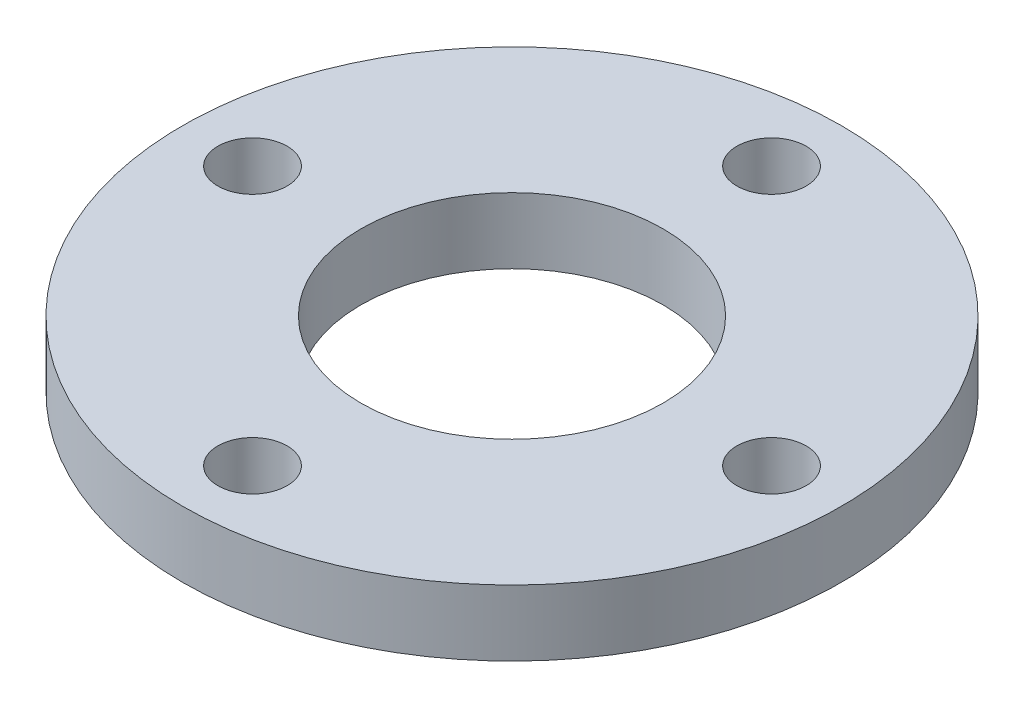
ISO-10303-21;
HEADER;
FILE_DESCRIPTION(('STEP AP214'),'2;1');
FILE_NAME('part.step','',(''),(''),'','','');
FILE_SCHEMA(('AUTOMOTIVE_DESIGN { 1 0 10303 214 1 1 1 1 }'));
ENDSEC;
DATA;
#1=APPLICATION_CONTEXT('core data for automotive mechanical design processes');
#2=APPLICATION_PROTOCOL_DEFINITION('international standard','automotive_design',2000,#1);
#3=PRODUCT_CONTEXT('',#1,'mechanical');
#4=PRODUCT('Part','Part','',(#3));
#5=PRODUCT_RELATED_PRODUCT_CATEGORY('part','',(#4));
#6=PRODUCT_DEFINITION_FORMATION('','',#4);
#7=PRODUCT_DEFINITION_CONTEXT('part definition',#1,'design');
#8=PRODUCT_DEFINITION('design','',#6,#7);
#9=PRODUCT_DEFINITION_SHAPE('','',#8);
#10=(LENGTH_UNIT() NAMED_UNIT(*) SI_UNIT(.MILLI.,.METRE.));
#11=(NAMED_UNIT(*) PLANE_ANGLE_UNIT() SI_UNIT($,.RADIAN.));
#12=(NAMED_UNIT(*) SI_UNIT($,.STERADIAN.) SOLID_ANGLE_UNIT());
#13=UNCERTAINTY_MEASURE_WITH_UNIT(LENGTH_MEASURE(1.E-05),#10,'distance_accuracy_value','');
#14=(GEOMETRIC_REPRESENTATION_CONTEXT(3) GLOBAL_UNCERTAINTY_ASSIGNED_CONTEXT((#13)) GLOBAL_UNIT_ASSIGNED_CONTEXT((#10,
#11,#12)) REPRESENTATION_CONTEXT('',''));
#15=CARTESIAN_POINT('',(0.,0.,0.));
#16=DIRECTION('',(0.,0.,1.));
#17=DIRECTION('',(1.,0.,0.));
#18=AXIS2_PLACEMENT_3D('',#15,#16,#17);
#19=CARTESIAN_POINT('',(0.,3.81,0.));
#20=DIRECTION('',(0.,1.,0.));
#21=DIRECTION('',(0.,0.,1.));
#22=AXIS2_PLACEMENT_3D('',#19,#20,#21);
#23=PLANE('',#22);
#24=CARTESIAN_POINT('',(-15.00124,3.81,0.));
#25=DIRECTION('',(0.,1.,0.));
#26=DIRECTION('',(0.,0.,1.));
#27=AXIS2_PLACEMENT_3D('',#24,#25,#26);
#28=CIRCLE('',#27,2.);
#29=CARTESIAN_POINT('',(-15.00124,3.81,-2.));
#30=VERTEX_POINT('',#29);
#31=EDGE_CURVE('E76',#30,#30,#28,.T.);
#32=ORIENTED_EDGE('',*,*,#31,.F.);
#33=EDGE_LOOP('',(#32));
#34=FACE_BOUND('',#33,.T.);
#35=CARTESIAN_POINT('',(15.00124,3.81,0.));
#36=DIRECTION('',(0.,1.,0.));
#37=DIRECTION('',(0.,0.,1.));
#38=AXIS2_PLACEMENT_3D('',#35,#36,#37);
#39=CIRCLE('',#38,2.);
#40=CARTESIAN_POINT('',(15.00124,3.81,-2.));
#41=VERTEX_POINT('',#40);
#42=EDGE_CURVE('E60',#41,#41,#39,.T.);
#43=ORIENTED_EDGE('',*,*,#42,.F.);
#44=EDGE_LOOP('',(#43));
#45=FACE_BOUND('',#44,.T.);
#46=CARTESIAN_POINT('',(0.,3.81,0.));
#47=DIRECTION('',(0.,1.,0.));
#48=DIRECTION('',(0.,0.,1.));
#49=AXIS2_PLACEMENT_3D('',#46,#47,#48);
#50=CIRCLE('',#49,19.05);
#51=CARTESIAN_POINT('',(0.,3.81,-19.05));
#52=VERTEX_POINT('',#51);
#53=EDGE_CURVE('E10',#52,#52,#50,.T.);
#54=ORIENTED_EDGE('',*,*,#53,.T.);
#55=EDGE_LOOP('',(#54));
#56=FACE_BOUND('',#55,.T.);
#57=CARTESIAN_POINT('',(0.,3.81,0.));
#58=DIRECTION('',(0.,1.,0.));
#59=DIRECTION('',(0.,0.,1.));
#60=AXIS2_PLACEMENT_3D('',#57,#58,#59);
#61=CIRCLE('',#60,8.73125);
#62=CARTESIAN_POINT('',(0.,3.81,-8.73125));
#63=VERTEX_POINT('',#62);
#64=EDGE_CURVE('E54',#63,#63,#61,.T.);
#65=ORIENTED_EDGE('',*,*,#64,.F.);
#66=EDGE_LOOP('',(#65));
#67=FACE_BOUND('',#66,.T.);
#68=CARTESIAN_POINT('',(0.,3.81,-15.00124));
#69=DIRECTION('',(0.,1.,0.));
#70=DIRECTION('',(0.,0.,1.));
#71=AXIS2_PLACEMENT_3D('',#68,#69,#70);
#72=CIRCLE('',#71,2.);
#73=CARTESIAN_POINT('',(0.,3.81,-17.00124));
#74=VERTEX_POINT('',#73);
#75=EDGE_CURVE('E68',#74,#74,#72,.T.);
#76=ORIENTED_EDGE('',*,*,#75,.F.);
#77=EDGE_LOOP('',(#76));
#78=FACE_BOUND('',#77,.T.);
#79=CARTESIAN_POINT('',(0.,3.81,15.00124));
#80=DIRECTION('',(0.,1.,0.));
#81=DIRECTION('',(0.,0.,1.));
#82=AXIS2_PLACEMENT_3D('',#79,#80,#81);
#83=CIRCLE('',#82,2.);
#84=CARTESIAN_POINT('',(0.,3.81,13.00124));
#85=VERTEX_POINT('',#84);
#86=EDGE_CURVE('E84',#85,#85,#83,.T.);
#87=ORIENTED_EDGE('',*,*,#86,.F.);
#88=EDGE_LOOP('',(#87));
#89=FACE_BOUND('',#88,.T.);
#90=ADVANCED_FACE('F41',(#34,#45,#56,#67,#78,#89),#23,.T.);
#91=CARTESIAN_POINT('',(0.,0.,0.));
#92=DIRECTION('',(0.,1.,0.));
#93=DIRECTION('',(0.,0.,1.));
#94=AXIS2_PLACEMENT_3D('',#91,#92,#93);
#95=PLANE('',#94);
#96=CARTESIAN_POINT('',(0.,0.,0.));
#97=DIRECTION('',(0.,1.,0.));
#98=DIRECTION('',(0.,0.,1.));
#99=AXIS2_PLACEMENT_3D('',#96,#97,#98);
#100=CIRCLE('',#99,19.05);
#101=CARTESIAN_POINT('',(0.,0.,-19.05));
#102=VERTEX_POINT('',#101);
#103=EDGE_CURVE('E45',#102,#102,#100,.T.);
#104=ORIENTED_EDGE('',*,*,#103,.F.);
#105=EDGE_LOOP('',(#104));
#106=FACE_BOUND('',#105,.T.);
#107=CARTESIAN_POINT('',(0.,0.,0.));
#108=DIRECTION('',(0.,1.,0.));
#109=DIRECTION('',(0.,0.,1.));
#110=AXIS2_PLACEMENT_3D('',#107,#108,#109);
#111=CIRCLE('',#110,8.73125);
#112=CARTESIAN_POINT('',(0.,0.,-8.73125));
#113=VERTEX_POINT('',#112);
#114=EDGE_CURVE('E56',#113,#113,#111,.T.);
#115=ORIENTED_EDGE('',*,*,#114,.T.);
#116=EDGE_LOOP('',(#115));
#117=FACE_BOUND('',#116,.T.);
#118=CARTESIAN_POINT('',(15.00124,0.,0.));
#119=DIRECTION('',(0.,1.,0.));
#120=DIRECTION('',(0.,0.,1.));
#121=AXIS2_PLACEMENT_3D('',#118,#119,#120);
#122=CIRCLE('',#121,2.);
#123=CARTESIAN_POINT('',(15.00124,0.,-2.));
#124=VERTEX_POINT('',#123);
#125=EDGE_CURVE('E64',#124,#124,#122,.T.);
#126=ORIENTED_EDGE('',*,*,#125,.T.);
#127=EDGE_LOOP('',(#126));
#128=FACE_BOUND('',#127,.T.);
#129=CARTESIAN_POINT('',(0.,0.,-15.00124));
#130=DIRECTION('',(0.,1.,0.));
#131=DIRECTION('',(0.,0.,1.));
#132=AXIS2_PLACEMENT_3D('',#129,#130,#131);
#133=CIRCLE('',#132,2.);
#134=CARTESIAN_POINT('',(0.,0.,-17.00124));
#135=VERTEX_POINT('',#134);
#136=EDGE_CURVE('E72',#135,#135,#133,.T.);
#137=ORIENTED_EDGE('',*,*,#136,.T.);
#138=EDGE_LOOP('',(#137));
#139=FACE_BOUND('',#138,.T.);
#140=CARTESIAN_POINT('',(-15.00124,0.,0.));
#141=DIRECTION('',(0.,1.,0.));
#142=DIRECTION('',(0.,0.,1.));
#143=AXIS2_PLACEMENT_3D('',#140,#141,#142);
#144=CIRCLE('',#143,2.);
#145=CARTESIAN_POINT('',(-15.00124,0.,-2.));
#146=VERTEX_POINT('',#145);
#147=EDGE_CURVE('E80',#146,#146,#144,.T.);
#148=ORIENTED_EDGE('',*,*,#147,.T.);
#149=EDGE_LOOP('',(#148));
#150=FACE_BOUND('',#149,.T.);
#151=CARTESIAN_POINT('',(0.,0.,15.00124));
#152=DIRECTION('',(0.,1.,0.));
#153=DIRECTION('',(0.,0.,1.));
#154=AXIS2_PLACEMENT_3D('',#151,#152,#153);
#155=CIRCLE('',#154,2.);
#156=CARTESIAN_POINT('',(0.,0.,13.00124));
#157=VERTEX_POINT('',#156);
#158=EDGE_CURVE('E88',#157,#157,#155,.T.);
#159=ORIENTED_EDGE('',*,*,#158,.T.);
#160=EDGE_LOOP('',(#159));
#161=FACE_BOUND('',#160,.T.);
#162=ADVANCED_FACE('F100',(#106,#117,#128,#139,#150,#161),#95,.F.);
#163=CARTESIAN_POINT('',(0.,3.81,0.));
#164=DIRECTION('',(0.,-1.,0.));
#165=DIRECTION('',(0.,0.,-1.));
#166=AXIS2_PLACEMENT_3D('',#163,#164,#165);
#167=CYLINDRICAL_SURFACE('',#166,19.05);
#168=CARTESIAN_POINT('',(0.,3.81,-19.05));
#169=CARTESIAN_POINT('',(0.,3.7703125,-19.05));
#170=CARTESIAN_POINT('',(0.,3.730625,-19.05));
#171=CARTESIAN_POINT('',(0.,3.65125,-19.05));
#172=CARTESIAN_POINT('',(0.,3.6115625,-19.05));
#173=CARTESIAN_POINT('',(0.,3.5321875,-19.05));
#174=CARTESIAN_POINT('',(0.,3.4925,-19.05));
#175=CARTESIAN_POINT('',(0.,3.413125,-19.05));
#176=CARTESIAN_POINT('',(0.,3.3734375,-19.05));
#177=CARTESIAN_POINT('',(0.,3.2940625,-19.05));
#178=CARTESIAN_POINT('',(0.,3.254375,-19.05));
#179=CARTESIAN_POINT('',(0.,3.175,-19.05));
#180=CARTESIAN_POINT('',(0.,3.1353125,-19.05));
#181=CARTESIAN_POINT('',(0.,3.0559375,-19.05));
#182=CARTESIAN_POINT('',(0.,3.01625,-19.05));
#183=CARTESIAN_POINT('',(0.,2.936875,-19.05));
#184=CARTESIAN_POINT('',(0.,2.8971875,-19.05));
#185=CARTESIAN_POINT('',(0.,2.8178125,-19.05));
#186=CARTESIAN_POINT('',(0.,2.778125,-19.05));
#187=CARTESIAN_POINT('',(0.,2.69875,-19.05));
#188=CARTESIAN_POINT('',(0.,2.6590625,-19.05));
#189=CARTESIAN_POINT('',(0.,2.5796875,-19.05));
#190=CARTESIAN_POINT('',(0.,2.54,-19.05));
#191=CARTESIAN_POINT('',(0.,2.460625,-19.05));
#192=CARTESIAN_POINT('',(0.,2.4209375,-19.05));
#193=CARTESIAN_POINT('',(0.,2.3415625,-19.05));
#194=CARTESIAN_POINT('',(0.,2.301875,-19.05));
#195=CARTESIAN_POINT('',(0.,2.2225,-19.05));
#196=CARTESIAN_POINT('',(0.,2.1828125,-19.05));
#197=CARTESIAN_POINT('',(0.,2.1034375,-19.05));
#198=CARTESIAN_POINT('',(0.,2.06375,-19.05));
#199=CARTESIAN_POINT('',(0.,1.984375,-19.05));
#200=CARTESIAN_POINT('',(0.,1.9446875,-19.05));
#201=CARTESIAN_POINT('',(0.,1.8653125,-19.05));
#202=CARTESIAN_POINT('',(0.,1.825625,-19.05));
#203=CARTESIAN_POINT('',(0.,1.74625,-19.05));
#204=CARTESIAN_POINT('',(0.,1.7065625,-19.05));
#205=CARTESIAN_POINT('',(0.,1.6271875,-19.05));
#206=CARTESIAN_POINT('',(0.,1.5875,-19.05));
#207=CARTESIAN_POINT('',(0.,1.508125,-19.05));
#208=CARTESIAN_POINT('',(0.,1.4684375,-19.05));
#209=CARTESIAN_POINT('',(0.,1.3890625,-19.05));
#210=CARTESIAN_POINT('',(0.,1.349375,-19.05));
#211=CARTESIAN_POINT('',(0.,1.27,-19.05));
#212=CARTESIAN_POINT('',(0.,1.2303125,-19.05));
#213=CARTESIAN_POINT('',(0.,1.1509375,-19.05));
#214=CARTESIAN_POINT('',(0.,1.11125,-19.05));
#215=CARTESIAN_POINT('',(0.,1.031875,-19.05));
#216=CARTESIAN_POINT('',(0.,0.9921875,-19.05));
#217=CARTESIAN_POINT('',(0.,0.9128125,-19.05));
#218=CARTESIAN_POINT('',(0.,0.873125,-19.05));
#219=CARTESIAN_POINT('',(0.,0.79375,-19.05));
#220=CARTESIAN_POINT('',(0.,0.7540625,-19.05));
#221=CARTESIAN_POINT('',(0.,0.6746875,-19.05));
#222=CARTESIAN_POINT('',(0.,0.635,-19.05));
#223=CARTESIAN_POINT('',(0.,0.555625,-19.05));
#224=CARTESIAN_POINT('',(0.,0.5159375,-19.05));
#225=CARTESIAN_POINT('',(0.,0.4365625,-19.05));
#226=CARTESIAN_POINT('',(0.,0.396875,-19.05));
#227=CARTESIAN_POINT('',(0.,0.3175,-19.05));
#228=CARTESIAN_POINT('',(0.,0.2778125,-19.05));
#229=CARTESIAN_POINT('',(0.,0.1984375,-19.05));
#230=CARTESIAN_POINT('',(0.,0.15875,-19.05));
#231=CARTESIAN_POINT('',(0.,0.0793749999999999,-19.05));
#232=CARTESIAN_POINT('',(0.,0.0396874999999999,-19.05));
#233=CARTESIAN_POINT('',(0.,0.,-19.05));
#234=B_SPLINE_CURVE_WITH_KNOTS('',3,(#168,#169,#170,#171,#172,#173,#174,#175,#176,#177,#178,
#179,#180,#181,#182,#183,#184,#185,#186,#187,#188,#189,#190,#191,#192,#193,#194,#195,#196,#197,
#198,#199,#200,#201,#202,#203,#204,#205,#206,#207,#208,#209,#210,#211,#212,#213,#214,#215,#216,
#217,#218,#219,#220,#221,#222,#223,#224,#225,#226,#227,#228,#229,#230,#231,#232,#233),
.UNSPECIFIED.,.F.,.F.,(4,2,2,2,2,2,2,2,2,2,2,2,2,2,2,2,2,2,2,2,2,2,2,2,2,2,2,2,2,2,2,2,4),(0.,
0.1190625,0.238125,0.3571875,0.47625,0.5953125,0.714375,0.8334375,0.9525,1.0715625,1.190625,
1.3096875,1.42875,1.5478125,1.666875,1.7859375,1.905,2.0240625,2.143125,2.2621875,2.38125,
2.5003125,2.619375,2.7384375,2.8575,2.9765625,3.095625,3.2146875,3.33375,3.4528125,3.571875,
3.6909375,3.81),.UNSPECIFIED.);
#235=EDGE_CURVE('BSEAM43',#52,#102,#234,.T.);
#236=ORIENTED_EDGE('',*,*,#53,.F.);
#237=ORIENTED_EDGE('',*,*,#103,.T.);
#238=ORIENTED_EDGE('',*,*,#235,.T.);
#239=ORIENTED_EDGE('',*,*,#235,.F.);
#240=EDGE_LOOP('',(#236,#238,#237,#239));
#241=FACE_BOUND('',#240,.T.);
#242=ADVANCED_FACE('F43',(#241),#167,.T.);
#243=CARTESIAN_POINT('',(0.,3.81,0.));
#244=DIRECTION('',(0.,-1.,0.));
#245=DIRECTION('',(0.,0.,-1.));
#246=AXIS2_PLACEMENT_3D('',#243,#244,#245);
#247=CYLINDRICAL_SURFACE('',#246,8.73125);
#248=CARTESIAN_POINT('',(0.,3.81,-8.73125));
#249=CARTESIAN_POINT('',(0.,3.7703125,-8.73125));
#250=CARTESIAN_POINT('',(0.,3.730625,-8.73125));
#251=CARTESIAN_POINT('',(0.,3.65125,-8.73125));
#252=CARTESIAN_POINT('',(0.,3.6115625,-8.73125));
#253=CARTESIAN_POINT('',(0.,3.5321875,-8.73125));
#254=CARTESIAN_POINT('',(0.,3.4925,-8.73125));
#255=CARTESIAN_POINT('',(0.,3.413125,-8.73125));
#256=CARTESIAN_POINT('',(0.,3.3734375,-8.73125));
#257=CARTESIAN_POINT('',(0.,3.2940625,-8.73125));
#258=CARTESIAN_POINT('',(0.,3.254375,-8.73125));
#259=CARTESIAN_POINT('',(0.,3.175,-8.73125));
#260=CARTESIAN_POINT('',(0.,3.1353125,-8.73125));
#261=CARTESIAN_POINT('',(0.,3.0559375,-8.73125));
#262=CARTESIAN_POINT('',(0.,3.01625,-8.73125));
#263=CARTESIAN_POINT('',(0.,2.936875,-8.73125));
#264=CARTESIAN_POINT('',(0.,2.8971875,-8.73125));
#265=CARTESIAN_POINT('',(0.,2.8178125,-8.73125));
#266=CARTESIAN_POINT('',(0.,2.778125,-8.73125));
#267=CARTESIAN_POINT('',(0.,2.69875,-8.73125));
#268=CARTESIAN_POINT('',(0.,2.6590625,-8.73125));
#269=CARTESIAN_POINT('',(0.,2.5796875,-8.73125));
#270=CARTESIAN_POINT('',(0.,2.54,-8.73125));
#271=CARTESIAN_POINT('',(0.,2.460625,-8.73125));
#272=CARTESIAN_POINT('',(0.,2.4209375,-8.73125));
#273=CARTESIAN_POINT('',(0.,2.3415625,-8.73125));
#274=CARTESIAN_POINT('',(0.,2.301875,-8.73125));
#275=CARTESIAN_POINT('',(0.,2.2225,-8.73125));
#276=CARTESIAN_POINT('',(0.,2.1828125,-8.73125));
#277=CARTESIAN_POINT('',(0.,2.1034375,-8.73125));
#278=CARTESIAN_POINT('',(0.,2.06375,-8.73125));
#279=CARTESIAN_POINT('',(0.,1.984375,-8.73125));
#280=CARTESIAN_POINT('',(0.,1.9446875,-8.73125));
#281=CARTESIAN_POINT('',(0.,1.8653125,-8.73125));
#282=CARTESIAN_POINT('',(0.,1.825625,-8.73125));
#283=CARTESIAN_POINT('',(0.,1.74625,-8.73125));
#284=CARTESIAN_POINT('',(0.,1.7065625,-8.73125));
#285=CARTESIAN_POINT('',(0.,1.6271875,-8.73125));
#286=CARTESIAN_POINT('',(0.,1.5875,-8.73125));
#287=CARTESIAN_POINT('',(0.,1.508125,-8.73125));
#288=CARTESIAN_POINT('',(0.,1.4684375,-8.73125));
#289=CARTESIAN_POINT('',(0.,1.3890625,-8.73125));
#290=CARTESIAN_POINT('',(0.,1.349375,-8.73125));
#291=CARTESIAN_POINT('',(0.,1.27,-8.73125));
#292=CARTESIAN_POINT('',(0.,1.2303125,-8.73125));
#293=CARTESIAN_POINT('',(0.,1.1509375,-8.73125));
#294=CARTESIAN_POINT('',(0.,1.11125,-8.73125));
#295=CARTESIAN_POINT('',(0.,1.031875,-8.73125));
#296=CARTESIAN_POINT('',(0.,0.9921875,-8.73125));
#297=CARTESIAN_POINT('',(0.,0.9128125,-8.73125));
#298=CARTESIAN_POINT('',(0.,0.873125,-8.73125));
#299=CARTESIAN_POINT('',(0.,0.79375,-8.73125));
#300=CARTESIAN_POINT('',(0.,0.7540625,-8.73125));
#301=CARTESIAN_POINT('',(0.,0.6746875,-8.73125));
#302=CARTESIAN_POINT('',(0.,0.635,-8.73125));
#303=CARTESIAN_POINT('',(0.,0.555625,-8.73125));
#304=CARTESIAN_POINT('',(0.,0.5159375,-8.73125));
#305=CARTESIAN_POINT('',(0.,0.4365625,-8.73125));
#306=CARTESIAN_POINT('',(0.,0.396875,-8.73125));
#307=CARTESIAN_POINT('',(0.,0.3175,-8.73125));
#308=CARTESIAN_POINT('',(0.,0.2778125,-8.73125));
#309=CARTESIAN_POINT('',(0.,0.1984375,-8.73125));
#310=CARTESIAN_POINT('',(0.,0.15875,-8.73125));
#311=CARTESIAN_POINT('',(0.,0.0793749999999999,-8.73125));
#312=CARTESIAN_POINT('',(0.,0.0396874999999999,-8.73125));
#313=CARTESIAN_POINT('',(0.,0.,-8.73125));
#314=B_SPLINE_CURVE_WITH_KNOTS('',3,(#248,#249,#250,#251,#252,#253,#254,#255,#256,#257,#258,
#259,#260,#261,#262,#263,#264,#265,#266,#267,#268,#269,#270,#271,#272,#273,#274,#275,#276,#277,
#278,#279,#280,#281,#282,#283,#284,#285,#286,#287,#288,#289,#290,#291,#292,#293,#294,#295,#296,
#297,#298,#299,#300,#301,#302,#303,#304,#305,#306,#307,#308,#309,#310,#311,#312,#313),
.UNSPECIFIED.,.F.,.F.,(4,2,2,2,2,2,2,2,2,2,2,2,2,2,2,2,2,2,2,2,2,2,2,2,2,2,2,2,2,2,2,2,4),(0.,
0.1190625,0.238125,0.3571875,0.47625,0.595312499999999,0.714375,0.833437499999999,
0.952499999999999,1.0715625,1.190625,1.3096875,1.42875,1.5478125,1.666875,1.7859375,1.905,
2.0240625,2.143125,2.2621875,2.38125,2.5003125,2.619375,2.7384375,2.8575,2.9765625,3.095625,
3.2146875,3.33375,3.4528125,3.571875,3.6909375,3.81),.UNSPECIFIED.);
#315=EDGE_CURVE('BSEAM110',#63,#113,#314,.T.);
#316=ORIENTED_EDGE('',*,*,#64,.T.);
#317=ORIENTED_EDGE('',*,*,#114,.F.);
#318=ORIENTED_EDGE('',*,*,#315,.T.);
#319=ORIENTED_EDGE('',*,*,#315,.F.);
#320=EDGE_LOOP('',(#316,#318,#317,#319));
#321=FACE_BOUND('',#320,.T.);
#322=ADVANCED_FACE('F110',(#321),#247,.F.);
#323=CARTESIAN_POINT('',(15.00124,3.81,0.));
#324=DIRECTION('',(0.,-1.,0.));
#325=DIRECTION('',(0.,0.,-1.));
#326=AXIS2_PLACEMENT_3D('',#323,#324,#325);
#327=CYLINDRICAL_SURFACE('',#326,2.);
#328=CARTESIAN_POINT('',(15.00124,3.81,-2.));
#329=CARTESIAN_POINT('',(15.00124,3.7703125,-2.));
#330=CARTESIAN_POINT('',(15.00124,3.730625,-2.));
#331=CARTESIAN_POINT('',(15.00124,3.65125,-2.));
#332=CARTESIAN_POINT('',(15.00124,3.6115625,-2.));
#333=CARTESIAN_POINT('',(15.00124,3.5321875,-2.));
#334=CARTESIAN_POINT('',(15.00124,3.4925,-2.));
#335=CARTESIAN_POINT('',(15.00124,3.413125,-2.));
#336=CARTESIAN_POINT('',(15.00124,3.3734375,-2.));
#337=CARTESIAN_POINT('',(15.00124,3.2940625,-2.));
#338=CARTESIAN_POINT('',(15.00124,3.254375,-2.));
#339=CARTESIAN_POINT('',(15.00124,3.175,-2.));
#340=CARTESIAN_POINT('',(15.00124,3.1353125,-2.));
#341=CARTESIAN_POINT('',(15.00124,3.0559375,-2.));
#342=CARTESIAN_POINT('',(15.00124,3.01625,-2.));
#343=CARTESIAN_POINT('',(15.00124,2.936875,-2.));
#344=CARTESIAN_POINT('',(15.00124,2.8971875,-2.));
#345=CARTESIAN_POINT('',(15.00124,2.8178125,-2.));
#346=CARTESIAN_POINT('',(15.00124,2.778125,-2.));
#347=CARTESIAN_POINT('',(15.00124,2.69875,-2.));
#348=CARTESIAN_POINT('',(15.00124,2.6590625,-2.));
#349=CARTESIAN_POINT('',(15.00124,2.5796875,-2.));
#350=CARTESIAN_POINT('',(15.00124,2.54,-2.));
#351=CARTESIAN_POINT('',(15.00124,2.460625,-2.));
#352=CARTESIAN_POINT('',(15.00124,2.4209375,-2.));
#353=CARTESIAN_POINT('',(15.00124,2.3415625,-2.));
#354=CARTESIAN_POINT('',(15.00124,2.301875,-2.));
#355=CARTESIAN_POINT('',(15.00124,2.2225,-2.));
#356=CARTESIAN_POINT('',(15.00124,2.1828125,-2.));
#357=CARTESIAN_POINT('',(15.00124,2.1034375,-2.));
#358=CARTESIAN_POINT('',(15.00124,2.06375,-2.));
#359=CARTESIAN_POINT('',(15.00124,1.984375,-2.));
#360=CARTESIAN_POINT('',(15.00124,1.9446875,-2.));
#361=CARTESIAN_POINT('',(15.00124,1.8653125,-2.));
#362=CARTESIAN_POINT('',(15.00124,1.825625,-2.));
#363=CARTESIAN_POINT('',(15.00124,1.74625,-2.));
#364=CARTESIAN_POINT('',(15.00124,1.7065625,-2.));
#365=CARTESIAN_POINT('',(15.00124,1.6271875,-2.));
#366=CARTESIAN_POINT('',(15.00124,1.5875,-2.));
#367=CARTESIAN_POINT('',(15.00124,1.508125,-2.));
#368=CARTESIAN_POINT('',(15.00124,1.4684375,-2.));
#369=CARTESIAN_POINT('',(15.00124,1.3890625,-2.));
#370=CARTESIAN_POINT('',(15.00124,1.349375,-2.));
#371=CARTESIAN_POINT('',(15.00124,1.27,-2.));
#372=CARTESIAN_POINT('',(15.00124,1.2303125,-2.));
#373=CARTESIAN_POINT('',(15.00124,1.1509375,-2.));
#374=CARTESIAN_POINT('',(15.00124,1.11125,-2.));
#375=CARTESIAN_POINT('',(15.00124,1.031875,-2.));
#376=CARTESIAN_POINT('',(15.00124,0.9921875,-2.));
#377=CARTESIAN_POINT('',(15.00124,0.9128125,-2.));
#378=CARTESIAN_POINT('',(15.00124,0.873125,-2.));
#379=CARTESIAN_POINT('',(15.00124,0.79375,-2.));
#380=CARTESIAN_POINT('',(15.00124,0.7540625,-2.));
#381=CARTESIAN_POINT('',(15.00124,0.6746875,-2.));
#382=CARTESIAN_POINT('',(15.00124,0.635,-2.));
#383=CARTESIAN_POINT('',(15.00124,0.555625,-2.));
#384=CARTESIAN_POINT('',(15.00124,0.5159375,-2.));
#385=CARTESIAN_POINT('',(15.00124,0.4365625,-2.));
#386=CARTESIAN_POINT('',(15.00124,0.396875,-2.));
#387=CARTESIAN_POINT('',(15.00124,0.3175,-2.));
#388=CARTESIAN_POINT('',(15.00124,0.2778125,-2.));
#389=CARTESIAN_POINT('',(15.00124,0.1984375,-2.));
#390=CARTESIAN_POINT('',(15.00124,0.15875,-2.));
#391=CARTESIAN_POINT('',(15.00124,0.0793749999999999,-2.));
#392=CARTESIAN_POINT('',(15.00124,0.0396874999999999,-2.));
#393=CARTESIAN_POINT('',(15.00124,0.,-2.));
#394=B_SPLINE_CURVE_WITH_KNOTS('',3,(#328,#329,#330,#331,#332,#333,#334,#335,#336,#337,#338,
#339,#340,#341,#342,#343,#344,#345,#346,#347,#348,#349,#350,#351,#352,#353,#354,#355,#356,#357,
#358,#359,#360,#361,#362,#363,#364,#365,#366,#367,#368,#369,#370,#371,#372,#373,#374,#375,#376,
#377,#378,#379,#380,#381,#382,#383,#384,#385,#386,#387,#388,#389,#390,#391,#392,#393),
.UNSPECIFIED.,.F.,.F.,(4,2,2,2,2,2,2,2,2,2,2,2,2,2,2,2,2,2,2,2,2,2,2,2,2,2,2,2,2,2,2,2,4),(0.,
0.1190625,0.238125,0.3571875,0.47625,0.595312499999999,0.714375,0.833437499999999,
0.952499999999999,1.0715625,1.190625,1.3096875,1.42875,1.5478125,1.666875,1.7859375,1.905,
2.0240625,2.143125,2.2621875,2.38125,2.5003125,2.619375,2.7384375,2.8575,2.9765625,3.095625,
3.2146875,3.33375,3.4528125,3.571875,3.6909375,3.81),.UNSPECIFIED.);
#395=EDGE_CURVE('BSEAM113',#41,#124,#394,.T.);
#396=ORIENTED_EDGE('',*,*,#42,.T.);
#397=ORIENTED_EDGE('',*,*,#125,.F.);
#398=ORIENTED_EDGE('',*,*,#395,.T.);
#399=ORIENTED_EDGE('',*,*,#395,.F.);
#400=EDGE_LOOP('',(#396,#398,#397,#399));
#401=FACE_BOUND('',#400,.T.);
#402=ADVANCED_FACE('F113',(#401),#327,.F.);
#403=CARTESIAN_POINT('',(0.,3.81,-15.00124));
#404=DIRECTION('',(0.,-1.,0.));
#405=DIRECTION('',(0.,0.,-1.));
#406=AXIS2_PLACEMENT_3D('',#403,#404,#405);
#407=CYLINDRICAL_SURFACE('',#406,2.);
#408=CARTESIAN_POINT('',(0.,3.81,-17.00124));
#409=CARTESIAN_POINT('',(0.,3.7703125,-17.00124));
#410=CARTESIAN_POINT('',(0.,3.730625,-17.00124));
#411=CARTESIAN_POINT('',(0.,3.65125,-17.00124));
#412=CARTESIAN_POINT('',(0.,3.6115625,-17.00124));
#413=CARTESIAN_POINT('',(0.,3.5321875,-17.00124));
#414=CARTESIAN_POINT('',(0.,3.4925,-17.00124));
#415=CARTESIAN_POINT('',(0.,3.413125,-17.00124));
#416=CARTESIAN_POINT('',(0.,3.3734375,-17.00124));
#417=CARTESIAN_POINT('',(0.,3.2940625,-17.00124));
#418=CARTESIAN_POINT('',(0.,3.254375,-17.00124));
#419=CARTESIAN_POINT('',(0.,3.175,-17.00124));
#420=CARTESIAN_POINT('',(0.,3.1353125,-17.00124));
#421=CARTESIAN_POINT('',(0.,3.0559375,-17.00124));
#422=CARTESIAN_POINT('',(0.,3.01625,-17.00124));
#423=CARTESIAN_POINT('',(0.,2.936875,-17.00124));
#424=CARTESIAN_POINT('',(0.,2.8971875,-17.00124));
#425=CARTESIAN_POINT('',(0.,2.8178125,-17.00124));
#426=CARTESIAN_POINT('',(0.,2.778125,-17.00124));
#427=CARTESIAN_POINT('',(0.,2.69875,-17.00124));
#428=CARTESIAN_POINT('',(0.,2.6590625,-17.00124));
#429=CARTESIAN_POINT('',(0.,2.5796875,-17.00124));
#430=CARTESIAN_POINT('',(0.,2.54,-17.00124));
#431=CARTESIAN_POINT('',(0.,2.460625,-17.00124));
#432=CARTESIAN_POINT('',(0.,2.4209375,-17.00124));
#433=CARTESIAN_POINT('',(0.,2.3415625,-17.00124));
#434=CARTESIAN_POINT('',(0.,2.301875,-17.00124));
#435=CARTESIAN_POINT('',(0.,2.2225,-17.00124));
#436=CARTESIAN_POINT('',(0.,2.1828125,-17.00124));
#437=CARTESIAN_POINT('',(0.,2.1034375,-17.00124));
#438=CARTESIAN_POINT('',(0.,2.06375,-17.00124));
#439=CARTESIAN_POINT('',(0.,1.984375,-17.00124));
#440=CARTESIAN_POINT('',(0.,1.9446875,-17.00124));
#441=CARTESIAN_POINT('',(0.,1.8653125,-17.00124));
#442=CARTESIAN_POINT('',(0.,1.825625,-17.00124));
#443=CARTESIAN_POINT('',(0.,1.74625,-17.00124));
#444=CARTESIAN_POINT('',(0.,1.7065625,-17.00124));
#445=CARTESIAN_POINT('',(0.,1.6271875,-17.00124));
#446=CARTESIAN_POINT('',(0.,1.5875,-17.00124));
#447=CARTESIAN_POINT('',(0.,1.508125,-17.00124));
#448=CARTESIAN_POINT('',(0.,1.4684375,-17.00124));
#449=CARTESIAN_POINT('',(0.,1.3890625,-17.00124));
#450=CARTESIAN_POINT('',(0.,1.349375,-17.00124));
#451=CARTESIAN_POINT('',(0.,1.27,-17.00124));
#452=CARTESIAN_POINT('',(0.,1.2303125,-17.00124));
#453=CARTESIAN_POINT('',(0.,1.1509375,-17.00124));
#454=CARTESIAN_POINT('',(0.,1.11125,-17.00124));
#455=CARTESIAN_POINT('',(0.,1.031875,-17.00124));
#456=CARTESIAN_POINT('',(0.,0.9921875,-17.00124));
#457=CARTESIAN_POINT('',(0.,0.9128125,-17.00124));
#458=CARTESIAN_POINT('',(0.,0.873125,-17.00124));
#459=CARTESIAN_POINT('',(0.,0.79375,-17.00124));
#460=CARTESIAN_POINT('',(0.,0.7540625,-17.00124));
#461=CARTESIAN_POINT('',(0.,0.6746875,-17.00124));
#462=CARTESIAN_POINT('',(0.,0.635,-17.00124));
#463=CARTESIAN_POINT('',(0.,0.555625,-17.00124));
#464=CARTESIAN_POINT('',(0.,0.5159375,-17.00124));
#465=CARTESIAN_POINT('',(0.,0.4365625,-17.00124));
#466=CARTESIAN_POINT('',(0.,0.396875,-17.00124));
#467=CARTESIAN_POINT('',(0.,0.3175,-17.00124));
#468=CARTESIAN_POINT('',(0.,0.2778125,-17.00124));
#469=CARTESIAN_POINT('',(0.,0.1984375,-17.00124));
#470=CARTESIAN_POINT('',(0.,0.15875,-17.00124));
#471=CARTESIAN_POINT('',(0.,0.0793749999999999,-17.00124));
#472=CARTESIAN_POINT('',(0.,0.0396874999999999,-17.00124));
#473=CARTESIAN_POINT('',(0.,0.,-17.00124));
#474=B_SPLINE_CURVE_WITH_KNOTS('',3,(#408,#409,#410,#411,#412,#413,#414,#415,#416,#417,#418,
#419,#420,#421,#422,#423,#424,#425,#426,#427,#428,#429,#430,#431,#432,#433,#434,#435,#436,#437,
#438,#439,#440,#441,#442,#443,#444,#445,#446,#447,#448,#449,#450,#451,#452,#453,#454,#455,#456,
#457,#458,#459,#460,#461,#462,#463,#464,#465,#466,#467,#468,#469,#470,#471,#472,#473),
.UNSPECIFIED.,.F.,.F.,(4,2,2,2,2,2,2,2,2,2,2,2,2,2,2,2,2,2,2,2,2,2,2,2,2,2,2,2,2,2,2,2,4),(0.,
0.1190625,0.238125,0.3571875,0.47625,0.595312499999999,0.714375,0.833437499999999,
0.952499999999999,1.0715625,1.190625,1.3096875,1.42875,1.5478125,1.666875,1.7859375,1.905,
2.0240625,2.143125,2.2621875,2.38125,2.5003125,2.619375,2.7384375,2.8575,2.9765625,3.095625,
3.2146875,3.33375,3.4528125,3.571875,3.6909375,3.81),.UNSPECIFIED.);
#475=EDGE_CURVE('BSEAM117',#74,#135,#474,.T.);
#476=ORIENTED_EDGE('',*,*,#75,.T.);
#477=ORIENTED_EDGE('',*,*,#136,.F.);
#478=ORIENTED_EDGE('',*,*,#475,.T.);
#479=ORIENTED_EDGE('',*,*,#475,.F.);
#480=EDGE_LOOP('',(#476,#478,#477,#479));
#481=FACE_BOUND('',#480,.T.);
#482=ADVANCED_FACE('F117',(#481),#407,.F.);
#483=CARTESIAN_POINT('',(-15.00124,3.81,0.));
#484=DIRECTION('',(0.,-1.,0.));
#485=DIRECTION('',(0.,0.,-1.));
#486=AXIS2_PLACEMENT_3D('',#483,#484,#485);
#487=CYLINDRICAL_SURFACE('',#486,2.);
#488=CARTESIAN_POINT('',(-15.00124,3.81,-2.));
#489=CARTESIAN_POINT('',(-15.00124,3.7703125,-2.));
#490=CARTESIAN_POINT('',(-15.00124,3.730625,-2.));
#491=CARTESIAN_POINT('',(-15.00124,3.65125,-2.));
#492=CARTESIAN_POINT('',(-15.00124,3.6115625,-2.));
#493=CARTESIAN_POINT('',(-15.00124,3.5321875,-2.));
#494=CARTESIAN_POINT('',(-15.00124,3.4925,-2.));
#495=CARTESIAN_POINT('',(-15.00124,3.413125,-2.));
#496=CARTESIAN_POINT('',(-15.00124,3.3734375,-2.));
#497=CARTESIAN_POINT('',(-15.00124,3.2940625,-2.));
#498=CARTESIAN_POINT('',(-15.00124,3.254375,-2.));
#499=CARTESIAN_POINT('',(-15.00124,3.175,-2.));
#500=CARTESIAN_POINT('',(-15.00124,3.1353125,-2.));
#501=CARTESIAN_POINT('',(-15.00124,3.0559375,-2.));
#502=CARTESIAN_POINT('',(-15.00124,3.01625,-2.));
#503=CARTESIAN_POINT('',(-15.00124,2.936875,-2.));
#504=CARTESIAN_POINT('',(-15.00124,2.8971875,-2.));
#505=CARTESIAN_POINT('',(-15.00124,2.8178125,-2.));
#506=CARTESIAN_POINT('',(-15.00124,2.778125,-2.));
#507=CARTESIAN_POINT('',(-15.00124,2.69875,-2.));
#508=CARTESIAN_POINT('',(-15.00124,2.6590625,-2.));
#509=CARTESIAN_POINT('',(-15.00124,2.5796875,-2.));
#510=CARTESIAN_POINT('',(-15.00124,2.54,-2.));
#511=CARTESIAN_POINT('',(-15.00124,2.460625,-2.));
#512=CARTESIAN_POINT('',(-15.00124,2.4209375,-2.));
#513=CARTESIAN_POINT('',(-15.00124,2.3415625,-2.));
#514=CARTESIAN_POINT('',(-15.00124,2.301875,-2.));
#515=CARTESIAN_POINT('',(-15.00124,2.2225,-2.));
#516=CARTESIAN_POINT('',(-15.00124,2.1828125,-2.));
#517=CARTESIAN_POINT('',(-15.00124,2.1034375,-2.));
#518=CARTESIAN_POINT('',(-15.00124,2.06375,-2.));
#519=CARTESIAN_POINT('',(-15.00124,1.984375,-2.));
#520=CARTESIAN_POINT('',(-15.00124,1.9446875,-2.));
#521=CARTESIAN_POINT('',(-15.00124,1.8653125,-2.));
#522=CARTESIAN_POINT('',(-15.00124,1.825625,-2.));
#523=CARTESIAN_POINT('',(-15.00124,1.74625,-2.));
#524=CARTESIAN_POINT('',(-15.00124,1.7065625,-2.));
#525=CARTESIAN_POINT('',(-15.00124,1.6271875,-2.));
#526=CARTESIAN_POINT('',(-15.00124,1.5875,-2.));
#527=CARTESIAN_POINT('',(-15.00124,1.508125,-2.));
#528=CARTESIAN_POINT('',(-15.00124,1.4684375,-2.));
#529=CARTESIAN_POINT('',(-15.00124,1.3890625,-2.));
#530=CARTESIAN_POINT('',(-15.00124,1.349375,-2.));
#531=CARTESIAN_POINT('',(-15.00124,1.27,-2.));
#532=CARTESIAN_POINT('',(-15.00124,1.2303125,-2.));
#533=CARTESIAN_POINT('',(-15.00124,1.1509375,-2.));
#534=CARTESIAN_POINT('',(-15.00124,1.11125,-2.));
#535=CARTESIAN_POINT('',(-15.00124,1.031875,-2.));
#536=CARTESIAN_POINT('',(-15.00124,0.9921875,-2.));
#537=CARTESIAN_POINT('',(-15.00124,0.9128125,-2.));
#538=CARTESIAN_POINT('',(-15.00124,0.873125,-2.));
#539=CARTESIAN_POINT('',(-15.00124,0.79375,-2.));
#540=CARTESIAN_POINT('',(-15.00124,0.7540625,-2.));
#541=CARTESIAN_POINT('',(-15.00124,0.6746875,-2.));
#542=CARTESIAN_POINT('',(-15.00124,0.635,-2.));
#543=CARTESIAN_POINT('',(-15.00124,0.555625,-2.));
#544=CARTESIAN_POINT('',(-15.00124,0.5159375,-2.));
#545=CARTESIAN_POINT('',(-15.00124,0.4365625,-2.));
#546=CARTESIAN_POINT('',(-15.00124,0.396875,-2.));
#547=CARTESIAN_POINT('',(-15.00124,0.3175,-2.));
#548=CARTESIAN_POINT('',(-15.00124,0.2778125,-2.));
#549=CARTESIAN_POINT('',(-15.00124,0.1984375,-2.));
#550=CARTESIAN_POINT('',(-15.00124,0.15875,-2.));
#551=CARTESIAN_POINT('',(-15.00124,0.0793749999999999,-2.));
#552=CARTESIAN_POINT('',(-15.00124,0.0396874999999999,-2.));
#553=CARTESIAN_POINT('',(-15.00124,0.,-2.));
#554=B_SPLINE_CURVE_WITH_KNOTS('',3,(#488,#489,#490,#491,#492,#493,#494,#495,#496,#497,#498,
#499,#500,#501,#502,#503,#504,#505,#506,#507,#508,#509,#510,#511,#512,#513,#514,#515,#516,#517,
#518,#519,#520,#521,#522,#523,#524,#525,#526,#527,#528,#529,#530,#531,#532,#533,#534,#535,#536,
#537,#538,#539,#540,#541,#542,#543,#544,#545,#546,#547,#548,#549,#550,#551,#552,#553),
.UNSPECIFIED.,.F.,.F.,(4,2,2,2,2,2,2,2,2,2,2,2,2,2,2,2,2,2,2,2,2,2,2,2,2,2,2,2,2,2,2,2,4),(0.,
0.1190625,0.238125,0.3571875,0.47625,0.595312499999999,0.714375,0.833437499999999,
0.952499999999999,1.0715625,1.190625,1.3096875,1.42875,1.5478125,1.666875,1.7859375,1.905,
2.0240625,2.143125,2.2621875,2.38125,2.5003125,2.619375,2.7384375,2.8575,2.9765625,3.095625,
3.2146875,3.33375,3.4528125,3.571875,3.6909375,3.81),.UNSPECIFIED.);
#555=EDGE_CURVE('BSEAM121',#30,#146,#554,.T.);
#556=ORIENTED_EDGE('',*,*,#31,.T.);
#557=ORIENTED_EDGE('',*,*,#147,.F.);
#558=ORIENTED_EDGE('',*,*,#555,.T.);
#559=ORIENTED_EDGE('',*,*,#555,.F.);
#560=EDGE_LOOP('',(#556,#558,#557,#559));
#561=FACE_BOUND('',#560,.T.);
#562=ADVANCED_FACE('F121',(#561),#487,.F.);
#563=CARTESIAN_POINT('',(0.,3.81,15.00124));
#564=DIRECTION('',(0.,-1.,0.));
#565=DIRECTION('',(0.,0.,-1.));
#566=AXIS2_PLACEMENT_3D('',#563,#564,#565);
#567=CYLINDRICAL_SURFACE('',#566,2.);
#568=CARTESIAN_POINT('',(0.,3.81,13.00124));
#569=CARTESIAN_POINT('',(0.,3.7703125,13.00124));
#570=CARTESIAN_POINT('',(0.,3.730625,13.00124));
#571=CARTESIAN_POINT('',(0.,3.65125,13.00124));
#572=CARTESIAN_POINT('',(0.,3.6115625,13.00124));
#573=CARTESIAN_POINT('',(0.,3.5321875,13.00124));
#574=CARTESIAN_POINT('',(0.,3.4925,13.00124));
#575=CARTESIAN_POINT('',(0.,3.413125,13.00124));
#576=CARTESIAN_POINT('',(0.,3.3734375,13.00124));
#577=CARTESIAN_POINT('',(0.,3.2940625,13.00124));
#578=CARTESIAN_POINT('',(0.,3.254375,13.00124));
#579=CARTESIAN_POINT('',(0.,3.175,13.00124));
#580=CARTESIAN_POINT('',(0.,3.1353125,13.00124));
#581=CARTESIAN_POINT('',(0.,3.0559375,13.00124));
#582=CARTESIAN_POINT('',(0.,3.01625,13.00124));
#583=CARTESIAN_POINT('',(0.,2.936875,13.00124));
#584=CARTESIAN_POINT('',(0.,2.8971875,13.00124));
#585=CARTESIAN_POINT('',(0.,2.8178125,13.00124));
#586=CARTESIAN_POINT('',(0.,2.778125,13.00124));
#587=CARTESIAN_POINT('',(0.,2.69875,13.00124));
#588=CARTESIAN_POINT('',(0.,2.6590625,13.00124));
#589=CARTESIAN_POINT('',(0.,2.5796875,13.00124));
#590=CARTESIAN_POINT('',(0.,2.54,13.00124));
#591=CARTESIAN_POINT('',(0.,2.460625,13.00124));
#592=CARTESIAN_POINT('',(0.,2.4209375,13.00124));
#593=CARTESIAN_POINT('',(0.,2.3415625,13.00124));
#594=CARTESIAN_POINT('',(0.,2.301875,13.00124));
#595=CARTESIAN_POINT('',(0.,2.2225,13.00124));
#596=CARTESIAN_POINT('',(0.,2.1828125,13.00124));
#597=CARTESIAN_POINT('',(0.,2.1034375,13.00124));
#598=CARTESIAN_POINT('',(0.,2.06375,13.00124));
#599=CARTESIAN_POINT('',(0.,1.984375,13.00124));
#600=CARTESIAN_POINT('',(0.,1.9446875,13.00124));
#601=CARTESIAN_POINT('',(0.,1.8653125,13.00124));
#602=CARTESIAN_POINT('',(0.,1.825625,13.00124));
#603=CARTESIAN_POINT('',(0.,1.74625,13.00124));
#604=CARTESIAN_POINT('',(0.,1.7065625,13.00124));
#605=CARTESIAN_POINT('',(0.,1.6271875,13.00124));
#606=CARTESIAN_POINT('',(0.,1.5875,13.00124));
#607=CARTESIAN_POINT('',(0.,1.508125,13.00124));
#608=CARTESIAN_POINT('',(0.,1.4684375,13.00124));
#609=CARTESIAN_POINT('',(0.,1.3890625,13.00124));
#610=CARTESIAN_POINT('',(0.,1.349375,13.00124));
#611=CARTESIAN_POINT('',(0.,1.27,13.00124));
#612=CARTESIAN_POINT('',(0.,1.2303125,13.00124));
#613=CARTESIAN_POINT('',(0.,1.1509375,13.00124));
#614=CARTESIAN_POINT('',(0.,1.11125,13.00124));
#615=CARTESIAN_POINT('',(0.,1.031875,13.00124));
#616=CARTESIAN_POINT('',(0.,0.9921875,13.00124));
#617=CARTESIAN_POINT('',(0.,0.9128125,13.00124));
#618=CARTESIAN_POINT('',(0.,0.873125,13.00124));
#619=CARTESIAN_POINT('',(0.,0.79375,13.00124));
#620=CARTESIAN_POINT('',(0.,0.7540625,13.00124));
#621=CARTESIAN_POINT('',(0.,0.6746875,13.00124));
#622=CARTESIAN_POINT('',(0.,0.635,13.00124));
#623=CARTESIAN_POINT('',(0.,0.555625,13.00124));
#624=CARTESIAN_POINT('',(0.,0.5159375,13.00124));
#625=CARTESIAN_POINT('',(0.,0.4365625,13.00124));
#626=CARTESIAN_POINT('',(0.,0.396875,13.00124));
#627=CARTESIAN_POINT('',(0.,0.3175,13.00124));
#628=CARTESIAN_POINT('',(0.,0.2778125,13.00124));
#629=CARTESIAN_POINT('',(0.,0.1984375,13.00124));
#630=CARTESIAN_POINT('',(0.,0.15875,13.00124));
#631=CARTESIAN_POINT('',(0.,0.0793749999999999,13.00124));
#632=CARTESIAN_POINT('',(0.,0.0396874999999999,13.00124));
#633=CARTESIAN_POINT('',(0.,0.,13.00124));
#634=B_SPLINE_CURVE_WITH_KNOTS('',3,(#568,#569,#570,#571,#572,#573,#574,#575,#576,#577,#578,
#579,#580,#581,#582,#583,#584,#585,#586,#587,#588,#589,#590,#591,#592,#593,#594,#595,#596,#597,
#598,#599,#600,#601,#602,#603,#604,#605,#606,#607,#608,#609,#610,#611,#612,#613,#614,#615,#616,
#617,#618,#619,#620,#621,#622,#623,#624,#625,#626,#627,#628,#629,#630,#631,#632,#633),
.UNSPECIFIED.,.F.,.F.,(4,2,2,2,2,2,2,2,2,2,2,2,2,2,2,2,2,2,2,2,2,2,2,2,2,2,2,2,2,2,2,2,4),(0.,
0.1190625,0.238125,0.3571875,0.47625,0.595312499999999,0.714375,0.833437499999999,
0.952499999999999,1.0715625,1.190625,1.3096875,1.42875,1.5478125,1.666875,1.7859375,1.905,
2.0240625,2.143125,2.2621875,2.38125,2.5003125,2.619375,2.7384375,2.8575,2.9765625,3.095625,
3.2146875,3.33375,3.4528125,3.571875,3.6909375,3.81),.UNSPECIFIED.);
#635=EDGE_CURVE('BSEAM96',#85,#157,#634,.T.);
#636=ORIENTED_EDGE('',*,*,#86,.T.);
#637=ORIENTED_EDGE('',*,*,#158,.F.);
#638=ORIENTED_EDGE('',*,*,#635,.T.);
#639=ORIENTED_EDGE('',*,*,#635,.F.);
#640=EDGE_LOOP('',(#636,#638,#637,#639));
#641=FACE_BOUND('',#640,.T.);
#642=ADVANCED_FACE('F96',(#641),#567,.F.);
#643=CLOSED_SHELL('',(#90,#162,#242,#322,#402,#482,#562,#642));
#644=MANIFOLD_SOLID_BREP('B2',#643);
#645=ADVANCED_BREP_SHAPE_REPRESENTATION('',(#18,#644),#14);
#646=SHAPE_DEFINITION_REPRESENTATION(#9,#645);
ENDSEC;
END-ISO-10303-21;
